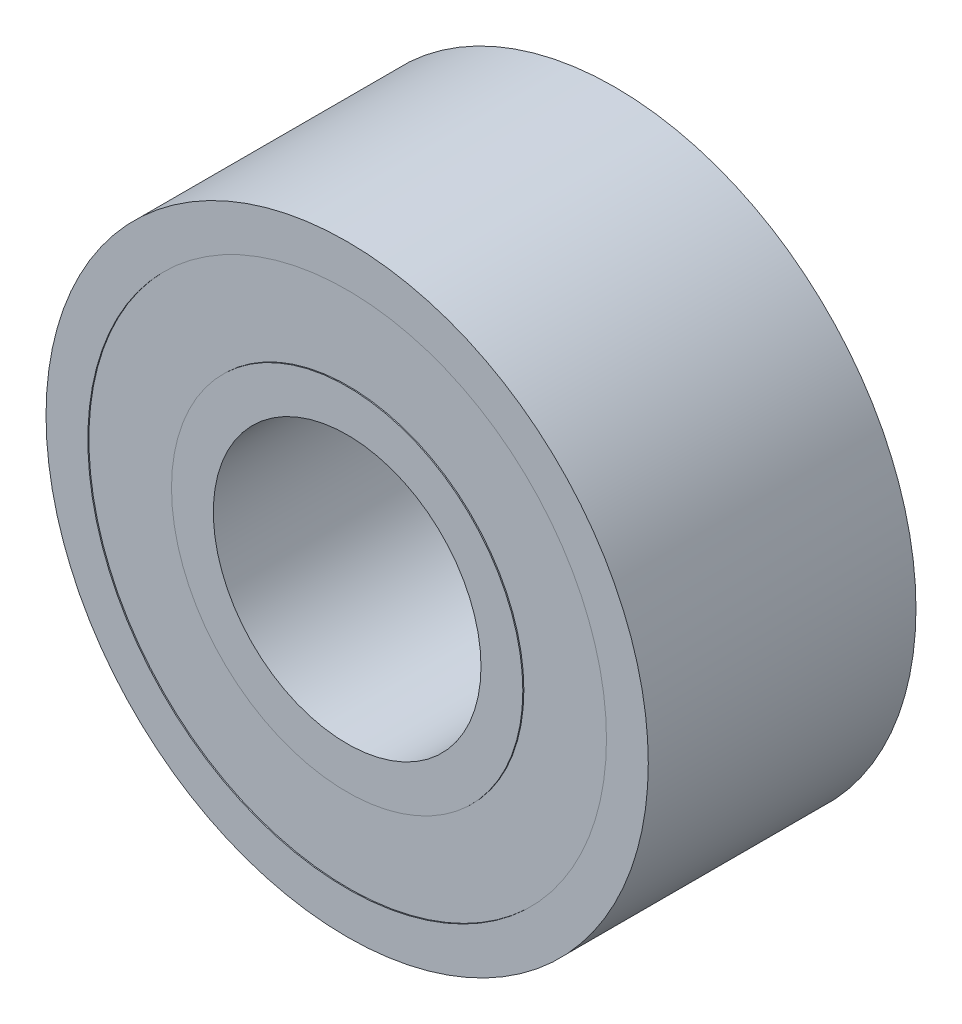
ISO-10303-21;
HEADER;
FILE_DESCRIPTION(('STEP AP214'),'2;1');
FILE_NAME('part.step','',(''),(''),'','','');
FILE_SCHEMA(('AUTOMOTIVE_DESIGN { 1 0 10303 214 1 1 1 1 }'));
ENDSEC;
DATA;
#1=APPLICATION_CONTEXT('core data for automotive mechanical design processes');
#2=APPLICATION_PROTOCOL_DEFINITION('international standard','automotive_design',2000,#1);
#3=PRODUCT_CONTEXT('',#1,'mechanical');
#4=PRODUCT('Part','Part','',(#3));
#5=PRODUCT_RELATED_PRODUCT_CATEGORY('part','',(#4));
#6=PRODUCT_DEFINITION_FORMATION('','',#4);
#7=PRODUCT_DEFINITION_CONTEXT('part definition',#1,'design');
#8=PRODUCT_DEFINITION('design','',#6,#7);
#9=PRODUCT_DEFINITION_SHAPE('','',#8);
#10=(LENGTH_UNIT() NAMED_UNIT(*) SI_UNIT(.MILLI.,.METRE.));
#11=(NAMED_UNIT(*) PLANE_ANGLE_UNIT() SI_UNIT($,.RADIAN.));
#12=(NAMED_UNIT(*) SI_UNIT($,.STERADIAN.) SOLID_ANGLE_UNIT());
#13=UNCERTAINTY_MEASURE_WITH_UNIT(LENGTH_MEASURE(1.E-05),#10,'distance_accuracy_value','');
#14=(GEOMETRIC_REPRESENTATION_CONTEXT(3) GLOBAL_UNCERTAINTY_ASSIGNED_CONTEXT((#13)) GLOBAL_UNIT_ASSIGNED_CONTEXT((#10,
#11,#12)) REPRESENTATION_CONTEXT('',''));
#15=CARTESIAN_POINT('',(0.,0.,0.));
#16=DIRECTION('',(0.,0.,1.));
#17=DIRECTION('',(1.,0.,0.));
#18=AXIS2_PLACEMENT_3D('',#15,#16,#17);
#19=CARTESIAN_POINT('',(0.,0.,-2.));
#20=DIRECTION('',(0.,0.,1.));
#21=DIRECTION('',(1.,0.,0.));
#22=AXIS2_PLACEMENT_3D('',#19,#20,#21);
#23=CYLINDRICAL_SURFACE('',#22,3.875);
#24=CARTESIAN_POINT('',(0.,0.,-2.));
#25=DIRECTION('',(0.,0.,1.));
#26=DIRECTION('',(1.,0.,0.));
#27=AXIS2_PLACEMENT_3D('',#24,#25,#26);
#28=CIRCLE('',#27,3.875);
#29=CARTESIAN_POINT('',(3.875,0.,-2.));
#30=VERTEX_POINT('',#29);
#31=EDGE_CURVE('E60',#30,#30,#28,.T.);
#32=ORIENTED_EDGE('',*,*,#31,.F.);
#33=EDGE_LOOP('',(#32));
#34=FACE_BOUND('',#33,.T.);
#35=CARTESIAN_POINT('',(0.,0.,-1.984375));
#36=DIRECTION('',(0.,0.,1.));
#37=DIRECTION('',(1.,0.,0.));
#38=AXIS2_PLACEMENT_3D('',#35,#36,#37);
#39=CIRCLE('',#38,3.875);
#40=CARTESIAN_POINT('',(3.875,0.,-1.984375));
#41=VERTEX_POINT('',#40);
#42=EDGE_CURVE('E11',#41,#41,#39,.F.);
#43=ORIENTED_EDGE('',*,*,#42,.F.);
#44=EDGE_LOOP('',(#43));
#45=FACE_BOUND('',#44,.T.);
#46=ADVANCED_FACE('F49',(#34,#45),#23,.F.);
#47=CARTESIAN_POINT('',(0.,0.,1.984375));
#48=DIRECTION('',(0.,0.,1.));
#49=DIRECTION('',(1.,0.,0.));
#50=AXIS2_PLACEMENT_3D('',#47,#48,#49);
#51=CIRCLE('',#50,3.875);
#52=CARTESIAN_POINT('',(3.875,0.,1.984375));
#53=VERTEX_POINT('',#52);
#54=EDGE_CURVE('E72',#53,#53,#51,.T.);
#55=ORIENTED_EDGE('',*,*,#54,.F.);
#56=EDGE_LOOP('',(#55));
#57=FACE_BOUND('',#56,.T.);
#58=CARTESIAN_POINT('',(0.,0.,2.));
#59=DIRECTION('',(0.,0.,1.));
#60=DIRECTION('',(1.,0.,0.));
#61=AXIS2_PLACEMENT_3D('',#58,#59,#60);
#62=CIRCLE('',#61,3.875);
#63=CARTESIAN_POINT('',(3.875,0.,2.));
#64=VERTEX_POINT('',#63);
#65=EDGE_CURVE('E69',#64,#64,#62,.T.);
#66=ORIENTED_EDGE('',*,*,#65,.T.);
#67=EDGE_LOOP('',(#66));
#68=FACE_BOUND('',#67,.T.);
#69=ADVANCED_FACE('F51',(#57,#68),#23,.F.);
#70=CARTESIAN_POINT('',(0.,0.,-2.));
#71=DIRECTION('',(0.,0.,1.));
#72=DIRECTION('',(1.,0.,0.));
#73=AXIS2_PLACEMENT_3D('',#70,#71,#72);
#74=CYLINDRICAL_SURFACE('',#73,4.5);
#75=CARTESIAN_POINT('',(0.,0.,-2.));
#76=DIRECTION('',(0.,0.,1.));
#77=DIRECTION('',(1.,0.,0.));
#78=AXIS2_PLACEMENT_3D('',#75,#76,#77);
#79=CIRCLE('',#78,4.5);
#80=CARTESIAN_POINT('',(4.5,0.,-2.));
#81=VERTEX_POINT('',#80);
#82=EDGE_CURVE('E56',#81,#81,#79,.T.);
#83=ORIENTED_EDGE('',*,*,#82,.T.);
#84=EDGE_LOOP('',(#83));
#85=FACE_BOUND('',#84,.T.);
#86=CARTESIAN_POINT('',(0.,0.,2.));
#87=DIRECTION('',(0.,0.,1.));
#88=DIRECTION('',(1.,0.,0.));
#89=AXIS2_PLACEMENT_3D('',#86,#87,#88);
#90=CIRCLE('',#89,4.5);
#91=CARTESIAN_POINT('',(4.5,0.,2.));
#92=VERTEX_POINT('',#91);
#93=EDGE_CURVE('E64',#92,#92,#90,.T.);
#94=ORIENTED_EDGE('',*,*,#93,.F.);
#95=EDGE_LOOP('',(#94));
#96=FACE_BOUND('',#95,.T.);
#97=ADVANCED_FACE('F124',(#85,#96),#74,.T.);
#98=CARTESIAN_POINT('',(0.,0.,-2.));
#99=DIRECTION('',(0.,0.,1.));
#100=DIRECTION('',(1.,0.,0.));
#101=AXIS2_PLACEMENT_3D('',#98,#99,#100);
#102=PLANE('',#101);
#103=ORIENTED_EDGE('',*,*,#31,.T.);
#104=EDGE_LOOP('',(#103));
#105=FACE_BOUND('',#104,.T.);
#106=ORIENTED_EDGE('',*,*,#82,.F.);
#107=EDGE_LOOP('',(#106));
#108=FACE_BOUND('',#107,.T.);
#109=ADVANCED_FACE('F129',(#105,#108),#102,.F.);
#110=CARTESIAN_POINT('',(0.,0.,2.));
#111=DIRECTION('',(0.,0.,1.));
#112=DIRECTION('',(1.,0.,0.));
#113=AXIS2_PLACEMENT_3D('',#110,#111,#112);
#114=PLANE('',#113);
#115=ORIENTED_EDGE('',*,*,#65,.F.);
#116=EDGE_LOOP('',(#115));
#117=FACE_BOUND('',#116,.T.);
#118=ORIENTED_EDGE('',*,*,#93,.T.);
#119=EDGE_LOOP('',(#118));
#120=FACE_BOUND('',#119,.T.);
#121=ADVANCED_FACE('F132',(#117,#120),#114,.T.);
#122=CARTESIAN_POINT('',(0.,0.,-1.984375));
#123=DIRECTION('',(0.,0.,1.));
#124=DIRECTION('',(1.,0.,0.));
#125=AXIS2_PLACEMENT_3D('',#122,#123,#124);
#126=PLANE('',#125);
#127=CARTESIAN_POINT('',(0.,0.,-1.984375));
#128=DIRECTION('',(0.,0.,1.));
#129=DIRECTION('',(1.,0.,0.));
#130=AXIS2_PLACEMENT_3D('',#127,#128,#129);
#131=CIRCLE('',#130,2.625);
#132=CARTESIAN_POINT('',(2.625,0.,-1.984375));
#133=VERTEX_POINT('',#132);
#134=EDGE_CURVE('E78',#133,#133,#131,.T.);
#135=ORIENTED_EDGE('',*,*,#134,.T.);
#136=EDGE_LOOP('',(#135));
#137=FACE_BOUND('',#136,.T.);
#138=ORIENTED_EDGE('',*,*,#42,.T.);
#139=EDGE_LOOP('',(#138));
#140=FACE_BOUND('',#139,.T.);
#141=ADVANCED_FACE('F138',(#137,#140),#126,.F.);
#142=CARTESIAN_POINT('',(0.,0.,1.984375));
#143=DIRECTION('',(0.,0.,1.));
#144=DIRECTION('',(1.,0.,0.));
#145=AXIS2_PLACEMENT_3D('',#142,#143,#144);
#146=PLANE('',#145);
#147=CARTESIAN_POINT('',(0.,0.,1.984375));
#148=DIRECTION('',(0.,0.,1.));
#149=DIRECTION('',(1.,0.,0.));
#150=AXIS2_PLACEMENT_3D('',#147,#148,#149);
#151=CIRCLE('',#150,2.625);
#152=CARTESIAN_POINT('',(2.625,0.,1.984375));
#153=VERTEX_POINT('',#152);
#154=EDGE_CURVE('E75',#153,#153,#151,.T.);
#155=ORIENTED_EDGE('',*,*,#154,.F.);
#156=EDGE_LOOP('',(#155));
#157=FACE_BOUND('',#156,.T.);
#158=ORIENTED_EDGE('',*,*,#54,.T.);
#159=EDGE_LOOP('',(#158));
#160=FACE_BOUND('',#159,.T.);
#161=ADVANCED_FACE('F117',(#157,#160),#146,.T.);
#162=CARTESIAN_POINT('',(0.,0.,-2.));
#163=DIRECTION('',(0.,0.,1.));
#164=DIRECTION('',(1.,0.,0.));
#165=AXIS2_PLACEMENT_3D('',#162,#163,#164);
#166=CYLINDRICAL_SURFACE('',#165,2.625);
#167=CARTESIAN_POINT('',(0.,0.,-2.));
#168=DIRECTION('',(0.,0.,1.));
#169=DIRECTION('',(1.,0.,0.));
#170=AXIS2_PLACEMENT_3D('',#167,#168,#169);
#171=CIRCLE('',#170,2.625);
#172=CARTESIAN_POINT('',(2.625,0.,-2.));
#173=VERTEX_POINT('',#172);
#174=EDGE_CURVE('E81',#173,#173,#171,.T.);
#175=ORIENTED_EDGE('',*,*,#174,.T.);
#176=EDGE_LOOP('',(#175));
#177=FACE_BOUND('',#176,.T.);
#178=ORIENTED_EDGE('',*,*,#134,.F.);
#179=EDGE_LOOP('',(#178));
#180=FACE_BOUND('',#179,.T.);
#181=ADVANCED_FACE('F107',(#177,#180),#166,.T.);
#182=CARTESIAN_POINT('',(0.,0.,-2.));
#183=DIRECTION('',(0.,0.,1.));
#184=DIRECTION('',(1.,0.,0.));
#185=AXIS2_PLACEMENT_3D('',#182,#183,#184);
#186=CYLINDRICAL_SURFACE('',#185,2.);
#187=CARTESIAN_POINT('',(0.,0.,-2.));
#188=DIRECTION('',(0.,0.,1.));
#189=DIRECTION('',(1.,0.,0.));
#190=AXIS2_PLACEMENT_3D('',#187,#188,#189);
#191=CIRCLE('',#190,2.);
#192=CARTESIAN_POINT('',(2.,0.,-2.));
#193=VERTEX_POINT('',#192);
#194=EDGE_CURVE('E84',#193,#193,#191,.T.);
#195=ORIENTED_EDGE('',*,*,#194,.F.);
#196=EDGE_LOOP('',(#195));
#197=FACE_BOUND('',#196,.T.);
#198=CARTESIAN_POINT('',(0.,0.,2.));
#199=DIRECTION('',(0.,0.,1.));
#200=DIRECTION('',(1.,0.,0.));
#201=AXIS2_PLACEMENT_3D('',#198,#199,#200);
#202=CIRCLE('',#201,2.);
#203=CARTESIAN_POINT('',(2.,0.,2.));
#204=VERTEX_POINT('',#203);
#205=EDGE_CURVE('E90',#204,#204,#202,.T.);
#206=ORIENTED_EDGE('',*,*,#205,.T.);
#207=EDGE_LOOP('',(#206));
#208=FACE_BOUND('',#207,.T.);
#209=ADVANCED_FACE('F94',(#197,#208),#186,.F.);
#210=ORIENTED_EDGE('',*,*,#154,.T.);
#211=EDGE_LOOP('',(#210));
#212=FACE_BOUND('',#211,.T.);
#213=CARTESIAN_POINT('',(0.,0.,2.));
#214=DIRECTION('',(0.,0.,1.));
#215=DIRECTION('',(1.,0.,0.));
#216=AXIS2_PLACEMENT_3D('',#213,#214,#215);
#217=CIRCLE('',#216,2.625);
#218=CARTESIAN_POINT('',(2.625,0.,2.));
#219=VERTEX_POINT('',#218);
#220=EDGE_CURVE('E87',#219,#219,#217,.T.);
#221=ORIENTED_EDGE('',*,*,#220,.F.);
#222=EDGE_LOOP('',(#221));
#223=FACE_BOUND('',#222,.T.);
#224=ADVANCED_FACE('F103',(#212,#223),#166,.T.);
#225=CARTESIAN_POINT('',(0.,0.,-2.));
#226=DIRECTION('',(0.,0.,1.));
#227=DIRECTION('',(1.,0.,0.));
#228=AXIS2_PLACEMENT_3D('',#225,#226,#227);
#229=PLANE('',#228);
#230=ORIENTED_EDGE('',*,*,#194,.T.);
#231=EDGE_LOOP('',(#230));
#232=FACE_BOUND('',#231,.T.);
#233=ORIENTED_EDGE('',*,*,#174,.F.);
#234=EDGE_LOOP('',(#233));
#235=FACE_BOUND('',#234,.T.);
#236=ADVANCED_FACE('F99',(#232,#235),#229,.F.);
#237=CARTESIAN_POINT('',(0.,0.,2.));
#238=DIRECTION('',(0.,0.,1.));
#239=DIRECTION('',(1.,0.,0.));
#240=AXIS2_PLACEMENT_3D('',#237,#238,#239);
#241=PLANE('',#240);
#242=ORIENTED_EDGE('',*,*,#205,.F.);
#243=EDGE_LOOP('',(#242));
#244=FACE_BOUND('',#243,.T.);
#245=ORIENTED_EDGE('',*,*,#220,.T.);
#246=EDGE_LOOP('',(#245));
#247=FACE_BOUND('',#246,.T.);
#248=ADVANCED_FACE('F96',(#244,#247),#241,.T.);
#249=CLOSED_SHELL('',(#46,#69,#97,#109,#121,#141,#161,#181,#209,#224,#236,#248));
#250=MANIFOLD_SOLID_BREP('B2',#249);
#251=ADVANCED_BREP_SHAPE_REPRESENTATION('',(#18,#250),#14);
#252=SHAPE_DEFINITION_REPRESENTATION(#9,#251);
ENDSEC;
END-ISO-10303-21;
